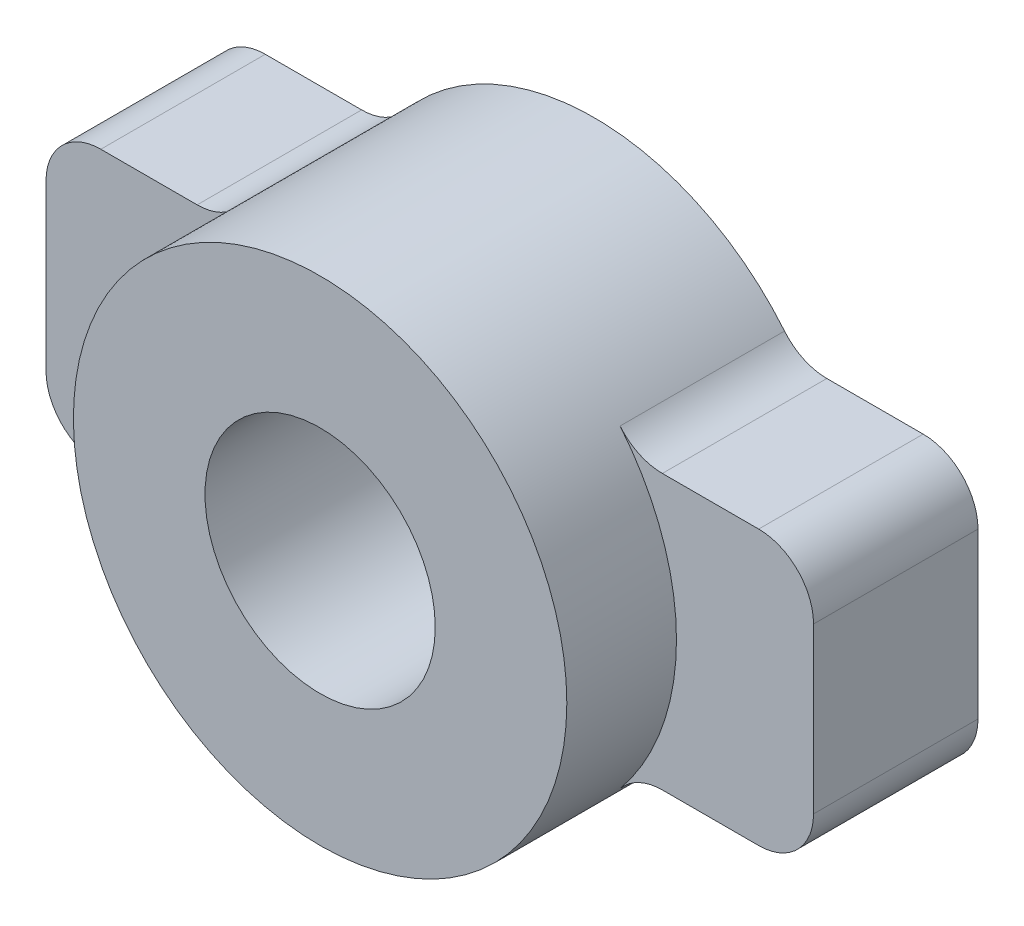
ISO-10303-21;
HEADER;
FILE_DESCRIPTION(('STEP AP214'),'2;1');
FILE_NAME('part.step','',(''),(''),'','','');
FILE_SCHEMA(('AUTOMOTIVE_DESIGN { 1 0 10303 214 1 1 1 1 }'));
ENDSEC;
DATA;
#1=APPLICATION_CONTEXT('core data for automotive mechanical design processes');
#2=APPLICATION_PROTOCOL_DEFINITION('international standard','automotive_design',2000,#1);
#3=PRODUCT_CONTEXT('',#1,'mechanical');
#4=PRODUCT('Part','Part','',(#3));
#5=PRODUCT_RELATED_PRODUCT_CATEGORY('part','',(#4));
#6=PRODUCT_DEFINITION_FORMATION('','',#4);
#7=PRODUCT_DEFINITION_CONTEXT('part definition',#1,'design');
#8=PRODUCT_DEFINITION('design','',#6,#7);
#9=PRODUCT_DEFINITION_SHAPE('','',#8);
#10=(LENGTH_UNIT() NAMED_UNIT(*) SI_UNIT(.MILLI.,.METRE.));
#11=(NAMED_UNIT(*) PLANE_ANGLE_UNIT() SI_UNIT($,.RADIAN.));
#12=(NAMED_UNIT(*) SI_UNIT($,.STERADIAN.) SOLID_ANGLE_UNIT());
#13=UNCERTAINTY_MEASURE_WITH_UNIT(LENGTH_MEASURE(1.E-05),#10,'distance_accuracy_value','');
#14=(GEOMETRIC_REPRESENTATION_CONTEXT(3) GLOBAL_UNCERTAINTY_ASSIGNED_CONTEXT((#13)) GLOBAL_UNIT_ASSIGNED_CONTEXT((#10,
#11,#12)) REPRESENTATION_CONTEXT('',''));
#15=CARTESIAN_POINT('',(0.,0.,0.));
#16=DIRECTION('',(0.,0.,1.));
#17=DIRECTION('',(1.,0.,0.));
#18=AXIS2_PLACEMENT_3D('',#15,#16,#17);
#19=CARTESIAN_POINT('',(0.,0.,5.));
#20=DIRECTION('',(0.,0.,-1.));
#21=DIRECTION('',(-1.,0.,0.));
#22=AXIS2_PLACEMENT_3D('',#19,#20,#21);
#23=CYLINDRICAL_SURFACE('',#22,4.5);
#24=CARTESIAN_POINT('',(0.,0.,0.));
#25=DIRECTION('',(0.,0.,1.));
#26=DIRECTION('',(1.,0.,0.));
#27=AXIS2_PLACEMENT_3D('',#24,#25,#26);
#28=CIRCLE('',#27,4.5);
#29=CARTESIAN_POINT('',(3.47125147127942,2.86363636363636,0.));
#30=VERTEX_POINT('',#29);
#31=CARTESIAN_POINT('',(-3.47125147127941,2.86363636363636,0.));
#32=VERTEX_POINT('',#31);
#33=EDGE_CURVE('E182',#30,#32,#28,.T.);
#34=ORIENTED_EDGE('',*,*,#33,.T.);
#35=DIRECTION('',(0.,0.,-1.));
#36=VECTOR('',#35,1.);
#37=CARTESIAN_POINT('',(-3.47125147127942,2.86363636363636,5.));
#38=LINE('',#37,#36);
#39=CARTESIAN_POINT('',(-3.47125147127941,2.86363636363636,3.));
#40=VERTEX_POINT('',#39);
#41=EDGE_CURVE('E175',#32,#40,#38,.F.);
#42=ORIENTED_EDGE('',*,*,#41,.T.);
#43=CARTESIAN_POINT('',(0.,0.,3.));
#44=DIRECTION('',(0.,0.,1.));
#45=DIRECTION('',(1.,0.,0.));
#46=AXIS2_PLACEMENT_3D('',#43,#44,#45);
#47=CIRCLE('',#46,4.5);
#48=CARTESIAN_POINT('',(-3.47125147127941,-2.86363636363636,3.));
#49=VERTEX_POINT('',#48);
#50=EDGE_CURVE('E173',#40,#49,#47,.T.);
#51=ORIENTED_EDGE('',*,*,#50,.T.);
#52=DIRECTION('',(0.,0.,-1.));
#53=VECTOR('',#52,1.);
#54=CARTESIAN_POINT('',(-3.47125147127942,-2.86363636363636,5.));
#55=LINE('',#54,#53);
#56=CARTESIAN_POINT('',(-3.47125147127941,-2.86363636363636,0.));
#57=VERTEX_POINT('',#56);
#58=EDGE_CURVE('E156',#49,#57,#55,.T.);
#59=ORIENTED_EDGE('',*,*,#58,.T.);
#60=CARTESIAN_POINT('',(3.47125147127942,-2.86363636363636,0.));
#61=VERTEX_POINT('',#60);
#62=EDGE_CURVE('E170',#57,#61,#28,.T.);
#63=ORIENTED_EDGE('',*,*,#62,.T.);
#64=DIRECTION('',(0.,0.,-1.));
#65=VECTOR('',#64,1.);
#66=CARTESIAN_POINT('',(3.47125147127942,-2.86363636363636,5.));
#67=LINE('',#66,#65);
#68=CARTESIAN_POINT('',(3.47125147127942,-2.86363636363636,3.));
#69=VERTEX_POINT('',#68);
#70=EDGE_CURVE('E193',#61,#69,#67,.F.);
#71=ORIENTED_EDGE('',*,*,#70,.T.);
#72=CARTESIAN_POINT('',(3.47125147127942,2.86363636363636,3.));
#73=VERTEX_POINT('',#72);
#74=EDGE_CURVE('E191',#69,#73,#47,.T.);
#75=ORIENTED_EDGE('',*,*,#74,.T.);
#76=DIRECTION('',(0.,0.,-1.));
#77=VECTOR('',#76,1.);
#78=CARTESIAN_POINT('',(3.47125147127942,2.86363636363636,5.));
#79=LINE('',#78,#77);
#80=EDGE_CURVE('E176',#73,#30,#79,.T.);
#81=ORIENTED_EDGE('',*,*,#80,.T.);
#82=EDGE_LOOP('',(#34,#42,#51,#59,#63,#71,#75,#81));
#83=FACE_BOUND('',#82,.T.);
#84=CARTESIAN_POINT('',(0.,0.,5.));
#85=DIRECTION('',(0.,0.,1.));
#86=DIRECTION('',(1.,0.,0.));
#87=AXIS2_PLACEMENT_3D('',#84,#85,#86);
#88=CIRCLE('',#87,4.5);
#89=CARTESIAN_POINT('',(4.5,0.,5.));
#90=VERTEX_POINT('',#89);
#91=EDGE_CURVE('E185',#90,#90,#88,.T.);
#92=ORIENTED_EDGE('',*,*,#91,.F.);
#93=EDGE_LOOP('',(#92));
#94=FACE_BOUND('',#93,.T.);
#95=ADVANCED_FACE('F40',(#83,#94),#23,.T.);
#96=CARTESIAN_POINT('',(0.,0.,5.));
#97=DIRECTION('',(0.,0.,1.));
#98=DIRECTION('',(1.,0.,0.));
#99=AXIS2_PLACEMENT_3D('',#96,#97,#98);
#100=PLANE('',#99);
#101=CARTESIAN_POINT('',(0.,0.,5.));
#102=DIRECTION('',(0.,0.,1.));
#103=DIRECTION('',(1.,0.,0.));
#104=AXIS2_PLACEMENT_3D('',#101,#102,#103);
#105=CIRCLE('',#104,2.1);
#106=CARTESIAN_POINT('',(2.1,0.,5.));
#107=VERTEX_POINT('',#106);
#108=EDGE_CURVE('E384',#107,#107,#105,.T.);
#109=ORIENTED_EDGE('',*,*,#108,.F.);
#110=EDGE_LOOP('',(#109));
#111=FACE_BOUND('',#110,.T.);
#112=ORIENTED_EDGE('',*,*,#91,.T.);
#113=EDGE_LOOP('',(#112));
#114=FACE_BOUND('',#113,.T.);
#115=ADVANCED_FACE('F326',(#111,#114),#100,.T.);
#116=CARTESIAN_POINT('',(0.,0.,0.));
#117=DIRECTION('',(0.,0.,1.));
#118=DIRECTION('',(1.,0.,0.));
#119=AXIS2_PLACEMENT_3D('',#116,#117,#118);
#120=PLANE('',#119);
#121=CARTESIAN_POINT('',(0.,0.,0.));
#122=DIRECTION('',(0.,0.,1.));
#123=DIRECTION('',(1.,0.,0.));
#124=AXIS2_PLACEMENT_3D('',#121,#122,#123);
#125=CIRCLE('',#124,2.1);
#126=CARTESIAN_POINT('',(2.1,0.,0.));
#127=VERTEX_POINT('',#126);
#128=EDGE_CURVE('E290',#127,#127,#125,.T.);
#129=ORIENTED_EDGE('',*,*,#128,.T.);
#130=EDGE_LOOP('',(#129));
#131=FACE_BOUND('',#130,.T.);
#132=DIRECTION('',(0.,1.,0.));
#133=VECTOR('',#132,1.);
#134=CARTESIAN_POINT('',(-7.,-2.5,0.));
#135=LINE('',#134,#133);
#136=CARTESIAN_POINT('',(-7.,-1.5,0.));
#137=VERTEX_POINT('',#136);
#138=CARTESIAN_POINT('',(-7.,1.5,0.));
#139=VERTEX_POINT('',#138);
#140=EDGE_CURVE('E287',#137,#139,#135,.T.);
#141=ORIENTED_EDGE('',*,*,#140,.T.);
#142=CARTESIAN_POINT('',(-6.,1.5,0.));
#143=DIRECTION('',(0.,0.,1.));
#144=DIRECTION('',(1.,0.,0.));
#145=AXIS2_PLACEMENT_3D('',#142,#143,#144);
#146=CIRCLE('',#145,1.);
#147=CARTESIAN_POINT('',(-6.,2.5,0.));
#148=VERTEX_POINT('',#147);
#149=EDGE_CURVE('E213',#139,#148,#146,.F.);
#150=ORIENTED_EDGE('',*,*,#149,.T.);
#151=DIRECTION('',(1.,0.,0.));
#152=VECTOR('',#151,1.);
#153=CARTESIAN_POINT('',(7.,2.5,0.));
#154=LINE('',#153,#152);
#155=CARTESIAN_POINT('',(-4.24264068711929,2.5,0.));
#156=VERTEX_POINT('',#155);
#157=EDGE_CURVE('E265',#148,#156,#154,.T.);
#158=ORIENTED_EDGE('',*,*,#157,.T.);
#159=CARTESIAN_POINT('',(-4.24264068711928,3.5,0.));
#160=DIRECTION('',(0.,0.,1.));
#161=DIRECTION('',(1.,0.,0.));
#162=AXIS2_PLACEMENT_3D('',#159,#160,#161);
#163=CIRCLE('',#162,1.);
#164=EDGE_CURVE('E163',#156,#32,#163,.T.);
#165=ORIENTED_EDGE('',*,*,#164,.T.);
#166=ORIENTED_EDGE('',*,*,#33,.F.);
#167=CARTESIAN_POINT('',(4.24264068711928,3.5,0.));
#168=DIRECTION('',(0.,0.,1.));
#169=DIRECTION('',(1.,0.,0.));
#170=AXIS2_PLACEMENT_3D('',#167,#168,#169);
#171=CIRCLE('',#170,1.);
#172=CARTESIAN_POINT('',(4.24264068711928,2.5,0.));
#173=VERTEX_POINT('',#172);
#174=EDGE_CURVE('E244',#30,#173,#171,.T.);
#175=ORIENTED_EDGE('',*,*,#174,.T.);
#176=CARTESIAN_POINT('',(6.,2.5,0.));
#177=VERTEX_POINT('',#176);
#178=EDGE_CURVE('E289',#173,#177,#154,.T.);
#179=ORIENTED_EDGE('',*,*,#178,.T.);
#180=CARTESIAN_POINT('',(6.,1.5,0.));
#181=DIRECTION('',(0.,0.,1.));
#182=DIRECTION('',(1.,0.,0.));
#183=AXIS2_PLACEMENT_3D('',#180,#181,#182);
#184=CIRCLE('',#183,1.);
#185=CARTESIAN_POINT('',(7.,1.5,0.));
#186=VERTEX_POINT('',#185);
#187=EDGE_CURVE('E209',#177,#186,#184,.F.);
#188=ORIENTED_EDGE('',*,*,#187,.T.);
#189=DIRECTION('',(0.,-1.,0.));
#190=VECTOR('',#189,1.);
#191=CARTESIAN_POINT('',(7.,-2.5,0.));
#192=LINE('',#191,#190);
#193=CARTESIAN_POINT('',(7.,-1.5,0.));
#194=VERTEX_POINT('',#193);
#195=EDGE_CURVE('E292',#186,#194,#192,.T.);
#196=ORIENTED_EDGE('',*,*,#195,.T.);
#197=CARTESIAN_POINT('',(6.,-1.5,0.));
#198=DIRECTION('',(0.,0.,1.));
#199=DIRECTION('',(1.,0.,0.));
#200=AXIS2_PLACEMENT_3D('',#197,#198,#199);
#201=CIRCLE('',#200,1.);
#202=CARTESIAN_POINT('',(6.,-2.5,0.));
#203=VERTEX_POINT('',#202);
#204=EDGE_CURVE('E207',#194,#203,#201,.F.);
#205=ORIENTED_EDGE('',*,*,#204,.T.);
#206=DIRECTION('',(-1.,0.,0.));
#207=VECTOR('',#206,1.);
#208=CARTESIAN_POINT('',(7.,-2.5,0.));
#209=LINE('',#208,#207);
#210=CARTESIAN_POINT('',(4.24264068711928,-2.5,0.));
#211=VERTEX_POINT('',#210);
#212=EDGE_CURVE('E295',#203,#211,#209,.T.);
#213=ORIENTED_EDGE('',*,*,#212,.T.);
#214=CARTESIAN_POINT('',(4.24264068711928,-3.5,0.));
#215=DIRECTION('',(0.,0.,1.));
#216=DIRECTION('',(1.,0.,0.));
#217=AXIS2_PLACEMENT_3D('',#214,#215,#216);
#218=CIRCLE('',#217,1.);
#219=EDGE_CURVE('E11',#211,#61,#218,.T.);
#220=ORIENTED_EDGE('',*,*,#219,.T.);
#221=ORIENTED_EDGE('',*,*,#62,.F.);
#222=CARTESIAN_POINT('',(-4.24264068711928,-3.5,0.));
#223=DIRECTION('',(0.,0.,1.));
#224=DIRECTION('',(1.,0.,0.));
#225=AXIS2_PLACEMENT_3D('',#222,#223,#224);
#226=CIRCLE('',#225,1.);
#227=CARTESIAN_POINT('',(-4.24264068711929,-2.5,0.));
#228=VERTEX_POINT('',#227);
#229=EDGE_CURVE('E152',#57,#228,#226,.T.);
#230=ORIENTED_EDGE('',*,*,#229,.T.);
#231=CARTESIAN_POINT('',(-6.,-2.5,0.));
#232=VERTEX_POINT('',#231);
#233=EDGE_CURVE('E294',#228,#232,#209,.T.);
#234=ORIENTED_EDGE('',*,*,#233,.T.);
#235=CARTESIAN_POINT('',(-6.,-1.5,0.));
#236=DIRECTION('',(0.,0.,1.));
#237=DIRECTION('',(1.,0.,0.));
#238=AXIS2_PLACEMENT_3D('',#235,#236,#237);
#239=CIRCLE('',#238,1.);
#240=EDGE_CURVE('E211',#232,#137,#239,.F.);
#241=ORIENTED_EDGE('',*,*,#240,.T.);
#242=EDGE_LOOP('',(#141,#150,#158,#165,#166,#175,#179,#188,#196,#205,#213,#220,#221,#230,#234,#241));
#243=FACE_BOUND('',#242,.T.);
#244=ADVANCED_FACE('F179',(#131,#243),#120,.F.);
#245=CARTESIAN_POINT('',(7.,-2.5,3.));
#246=DIRECTION('',(1.,0.,0.));
#247=DIRECTION('',(0.,0.,-1.));
#248=AXIS2_PLACEMENT_3D('',#245,#246,#247);
#249=PLANE('',#248);
#250=ORIENTED_EDGE('',*,*,#195,.F.);
#251=DIRECTION('',(0.,0.,-1.));
#252=VECTOR('',#251,1.);
#253=CARTESIAN_POINT('',(7.,1.5,3.));
#254=LINE('',#253,#252);
#255=CARTESIAN_POINT('',(7.,1.5,3.));
#256=VERTEX_POINT('',#255);
#257=EDGE_CURVE('E231',#186,#256,#254,.F.);
#258=ORIENTED_EDGE('',*,*,#257,.T.);
#259=DIRECTION('',(0.,-1.,0.));
#260=VECTOR('',#259,1.);
#261=CARTESIAN_POINT('',(7.,-2.5,3.));
#262=LINE('',#261,#260);
#263=CARTESIAN_POINT('',(7.,-1.5,3.));
#264=VERTEX_POINT('',#263);
#265=EDGE_CURVE('E279',#256,#264,#262,.T.);
#266=ORIENTED_EDGE('',*,*,#265,.T.);
#267=DIRECTION('',(0.,0.,-1.));
#268=VECTOR('',#267,1.);
#269=CARTESIAN_POINT('',(7.,-1.5,3.));
#270=LINE('',#269,#268);
#271=EDGE_CURVE('E228',#264,#194,#270,.T.);
#272=ORIENTED_EDGE('',*,*,#271,.T.);
#273=EDGE_LOOP('',(#250,#258,#266,#272));
#274=FACE_BOUND('',#273,.T.);
#275=ADVANCED_FACE('F361',(#274),#249,.T.);
#276=CARTESIAN_POINT('',(0.,0.,3.));
#277=DIRECTION('',(0.,0.,1.));
#278=DIRECTION('',(1.,0.,0.));
#279=AXIS2_PLACEMENT_3D('',#276,#277,#278);
#280=PLANE('',#279);
#281=ORIENTED_EDGE('',*,*,#265,.F.);
#282=CARTESIAN_POINT('',(6.,1.5,3.));
#283=DIRECTION('',(0.,0.,1.));
#284=DIRECTION('',(1.,0.,0.));
#285=AXIS2_PLACEMENT_3D('',#282,#283,#284);
#286=CIRCLE('',#285,1.);
#287=CARTESIAN_POINT('',(6.,2.5,3.));
#288=VERTEX_POINT('',#287);
#289=EDGE_CURVE('E235',#256,#288,#286,.T.);
#290=ORIENTED_EDGE('',*,*,#289,.T.);
#291=DIRECTION('',(1.,0.,0.));
#292=VECTOR('',#291,1.);
#293=CARTESIAN_POINT('',(7.,2.5,3.));
#294=LINE('',#293,#292);
#295=CARTESIAN_POINT('',(4.24264068711928,2.5,3.));
#296=VERTEX_POINT('',#295);
#297=EDGE_CURVE('E254',#296,#288,#294,.T.);
#298=ORIENTED_EDGE('',*,*,#297,.F.);
#299=CARTESIAN_POINT('',(4.24264068711928,3.5,3.));
#300=DIRECTION('',(0.,0.,1.));
#301=DIRECTION('',(1.,0.,0.));
#302=AXIS2_PLACEMENT_3D('',#299,#300,#301);
#303=CIRCLE('',#302,1.);
#304=EDGE_CURVE('E246',#296,#73,#303,.F.);
#305=ORIENTED_EDGE('',*,*,#304,.T.);
#306=ORIENTED_EDGE('',*,*,#74,.F.);
#307=CARTESIAN_POINT('',(4.24264068711928,-3.5,3.));
#308=DIRECTION('',(0.,0.,1.));
#309=DIRECTION('',(1.,0.,0.));
#310=AXIS2_PLACEMENT_3D('',#307,#308,#309);
#311=CIRCLE('',#310,1.);
#312=CARTESIAN_POINT('',(4.24264068711928,-2.5,3.));
#313=VERTEX_POINT('',#312);
#314=EDGE_CURVE('E48',#69,#313,#311,.F.);
#315=ORIENTED_EDGE('',*,*,#314,.T.);
#316=DIRECTION('',(-1.,0.,0.));
#317=VECTOR('',#316,1.);
#318=CARTESIAN_POINT('',(7.,-2.5,3.));
#319=LINE('',#318,#317);
#320=CARTESIAN_POINT('',(6.,-2.5,3.));
#321=VERTEX_POINT('',#320);
#322=EDGE_CURVE('E183',#321,#313,#319,.T.);
#323=ORIENTED_EDGE('',*,*,#322,.F.);
#324=CARTESIAN_POINT('',(6.,-1.5,3.));
#325=DIRECTION('',(0.,0.,1.));
#326=DIRECTION('',(1.,0.,0.));
#327=AXIS2_PLACEMENT_3D('',#324,#325,#326);
#328=CIRCLE('',#327,1.);
#329=EDGE_CURVE('E233',#321,#264,#328,.T.);
#330=ORIENTED_EDGE('',*,*,#329,.T.);
#331=EDGE_LOOP('',(#281,#290,#298,#305,#306,#315,#323,#330));
#332=FACE_BOUND('',#331,.T.);
#333=ADVANCED_FACE('F252',(#332),#280,.T.);
#334=CARTESIAN_POINT('',(7.,2.5,3.));
#335=DIRECTION('',(0.,1.,0.));
#336=DIRECTION('',(-1.,0.,0.));
#337=AXIS2_PLACEMENT_3D('',#334,#335,#336);
#338=PLANE('',#337);
#339=ORIENTED_EDGE('',*,*,#297,.T.);
#340=DIRECTION('',(0.,0.,-1.));
#341=VECTOR('',#340,1.);
#342=CARTESIAN_POINT('',(6.,2.5,3.));
#343=LINE('',#342,#341);
#344=EDGE_CURVE('E225',#288,#177,#343,.T.);
#345=ORIENTED_EDGE('',*,*,#344,.T.);
#346=ORIENTED_EDGE('',*,*,#178,.F.);
#347=DIRECTION('',(0.,0.,-1.));
#348=VECTOR('',#347,1.);
#349=CARTESIAN_POINT('',(4.24264068711928,2.5,3.));
#350=LINE('',#349,#348);
#351=EDGE_CURVE('E223',#173,#296,#350,.F.);
#352=ORIENTED_EDGE('',*,*,#351,.T.);
#353=EDGE_LOOP('',(#339,#345,#346,#352));
#354=FACE_BOUND('',#353,.T.);
#355=ADVANCED_FACE('F321',(#354),#338,.T.);
#356=CARTESIAN_POINT('',(7.,-2.5,3.));
#357=DIRECTION('',(0.,-1.,0.));
#358=DIRECTION('',(1.,0.,0.));
#359=AXIS2_PLACEMENT_3D('',#356,#357,#358);
#360=PLANE('',#359);
#361=ORIENTED_EDGE('',*,*,#322,.T.);
#362=DIRECTION('',(0.,0.,-1.));
#363=VECTOR('',#362,1.);
#364=CARTESIAN_POINT('',(4.24264068711928,-2.5,3.));
#365=LINE('',#364,#363);
#366=EDGE_CURVE('E238',#313,#211,#365,.T.);
#367=ORIENTED_EDGE('',*,*,#366,.T.);
#368=ORIENTED_EDGE('',*,*,#212,.F.);
#369=DIRECTION('',(0.,0.,-1.));
#370=VECTOR('',#369,1.);
#371=CARTESIAN_POINT('',(6.,-2.5,3.));
#372=LINE('',#371,#370);
#373=EDGE_CURVE('E61',#203,#321,#372,.F.);
#374=ORIENTED_EDGE('',*,*,#373,.T.);
#375=EDGE_LOOP('',(#361,#367,#368,#374));
#376=FACE_BOUND('',#375,.T.);
#377=ADVANCED_FACE('F315',(#376),#360,.T.);
#378=CARTESIAN_POINT('',(-6.,2.5,3.));
#379=VERTEX_POINT('',#378);
#380=CARTESIAN_POINT('',(-4.24264068711929,2.5,3.));
#381=VERTEX_POINT('',#380);
#382=EDGE_CURVE('E274',#379,#381,#294,.T.);
#383=ORIENTED_EDGE('',*,*,#382,.F.);
#384=CARTESIAN_POINT('',(-6.,1.5,3.));
#385=DIRECTION('',(0.,0.,1.));
#386=DIRECTION('',(1.,0.,0.));
#387=AXIS2_PLACEMENT_3D('',#384,#385,#386);
#388=CIRCLE('',#387,1.);
#389=CARTESIAN_POINT('',(-7.,1.5,3.));
#390=VERTEX_POINT('',#389);
#391=EDGE_CURVE('E217',#379,#390,#388,.T.);
#392=ORIENTED_EDGE('',*,*,#391,.T.);
#393=DIRECTION('',(0.,1.,0.));
#394=VECTOR('',#393,1.);
#395=CARTESIAN_POINT('',(-7.,-2.5,3.));
#396=LINE('',#395,#394);
#397=CARTESIAN_POINT('',(-7.,-1.5,3.));
#398=VERTEX_POINT('',#397);
#399=EDGE_CURVE('E283',#398,#390,#396,.T.);
#400=ORIENTED_EDGE('',*,*,#399,.F.);
#401=CARTESIAN_POINT('',(-6.,-1.5,3.));
#402=DIRECTION('',(0.,0.,1.));
#403=DIRECTION('',(1.,0.,0.));
#404=AXIS2_PLACEMENT_3D('',#401,#402,#403);
#405=CIRCLE('',#404,1.);
#406=CARTESIAN_POINT('',(-6.,-2.5,3.));
#407=VERTEX_POINT('',#406);
#408=EDGE_CURVE('E215',#398,#407,#405,.T.);
#409=ORIENTED_EDGE('',*,*,#408,.T.);
#410=CARTESIAN_POINT('',(-4.24264068711929,-2.5,3.));
#411=VERTEX_POINT('',#410);
#412=EDGE_CURVE('E186',#411,#407,#319,.T.);
#413=ORIENTED_EDGE('',*,*,#412,.F.);
#414=CARTESIAN_POINT('',(-4.24264068711928,-3.5,3.));
#415=DIRECTION('',(0.,0.,1.));
#416=DIRECTION('',(1.,0.,0.));
#417=AXIS2_PLACEMENT_3D('',#414,#415,#416);
#418=CIRCLE('',#417,1.);
#419=EDGE_CURVE('E162',#411,#49,#418,.F.);
#420=ORIENTED_EDGE('',*,*,#419,.T.);
#421=ORIENTED_EDGE('',*,*,#50,.F.);
#422=CARTESIAN_POINT('',(-4.24264068711928,3.5,3.));
#423=DIRECTION('',(0.,0.,1.));
#424=DIRECTION('',(1.,0.,0.));
#425=AXIS2_PLACEMENT_3D('',#422,#423,#424);
#426=CIRCLE('',#425,1.);
#427=EDGE_CURVE('E240',#40,#381,#426,.F.);
#428=ORIENTED_EDGE('',*,*,#427,.T.);
#429=EDGE_LOOP('',(#383,#392,#400,#409,#413,#420,#421,#428));
#430=FACE_BOUND('',#429,.T.);
#431=ADVANCED_FACE('F273',(#430),#280,.T.);
#432=ORIENTED_EDGE('',*,*,#412,.T.);
#433=DIRECTION('',(0.,0.,-1.));
#434=VECTOR('',#433,1.);
#435=CARTESIAN_POINT('',(-6.,-2.5,3.));
#436=LINE('',#435,#434);
#437=EDGE_CURVE('E220',#407,#232,#436,.T.);
#438=ORIENTED_EDGE('',*,*,#437,.T.);
#439=ORIENTED_EDGE('',*,*,#233,.F.);
#440=DIRECTION('',(0.,0.,-1.));
#441=VECTOR('',#440,1.);
#442=CARTESIAN_POINT('',(-4.24264068711929,-2.5,3.));
#443=LINE('',#442,#441);
#444=EDGE_CURVE('E157',#228,#411,#443,.F.);
#445=ORIENTED_EDGE('',*,*,#444,.T.);
#446=EDGE_LOOP('',(#432,#438,#439,#445));
#447=FACE_BOUND('',#446,.T.);
#448=ADVANCED_FACE('F312',(#447),#360,.T.);
#449=ORIENTED_EDGE('',*,*,#382,.T.);
#450=DIRECTION('',(0.,0.,-1.));
#451=VECTOR('',#450,1.);
#452=CARTESIAN_POINT('',(-4.24264068711929,2.5,3.));
#453=LINE('',#452,#451);
#454=EDGE_CURVE('E200',#381,#156,#453,.T.);
#455=ORIENTED_EDGE('',*,*,#454,.T.);
#456=ORIENTED_EDGE('',*,*,#157,.F.);
#457=DIRECTION('',(0.,0.,-1.));
#458=VECTOR('',#457,1.);
#459=CARTESIAN_POINT('',(-6.,2.5,3.));
#460=LINE('',#459,#458);
#461=EDGE_CURVE('E198',#148,#379,#460,.F.);
#462=ORIENTED_EDGE('',*,*,#461,.T.);
#463=EDGE_LOOP('',(#449,#455,#456,#462));
#464=FACE_BOUND('',#463,.T.);
#465=ADVANCED_FACE('F277',(#464),#338,.T.);
#466=CARTESIAN_POINT('',(-7.,-2.5,3.));
#467=DIRECTION('',(-1.,0.,0.));
#468=DIRECTION('',(0.,0.,1.));
#469=AXIS2_PLACEMENT_3D('',#466,#467,#468);
#470=PLANE('',#469);
#471=ORIENTED_EDGE('',*,*,#399,.T.);
#472=DIRECTION('',(0.,0.,-1.));
#473=VECTOR('',#472,1.);
#474=CARTESIAN_POINT('',(-7.,1.5,3.));
#475=LINE('',#474,#473);
#476=EDGE_CURVE('E204',#390,#139,#475,.T.);
#477=ORIENTED_EDGE('',*,*,#476,.T.);
#478=ORIENTED_EDGE('',*,*,#140,.F.);
#479=DIRECTION('',(0.,0.,-1.));
#480=VECTOR('',#479,1.);
#481=CARTESIAN_POINT('',(-7.,-1.5,3.));
#482=LINE('',#481,#480);
#483=EDGE_CURVE('E202',#137,#398,#482,.F.);
#484=ORIENTED_EDGE('',*,*,#483,.T.);
#485=EDGE_LOOP('',(#471,#477,#478,#484));
#486=FACE_BOUND('',#485,.T.);
#487=ADVANCED_FACE('F300',(#486),#470,.T.);
#488=CARTESIAN_POINT('',(0.,0.,5.));
#489=DIRECTION('',(0.,0.,1.));
#490=DIRECTION('',(1.,0.,0.));
#491=AXIS2_PLACEMENT_3D('',#488,#489,#490);
#492=CYLINDRICAL_SURFACE('',#491,2.1);
#493=ORIENTED_EDGE('',*,*,#128,.F.);
#494=EDGE_LOOP('',(#493));
#495=FACE_BOUND('',#494,.T.);
#496=ORIENTED_EDGE('',*,*,#108,.T.);
#497=EDGE_LOOP('',(#496));
#498=FACE_BOUND('',#497,.T.);
#499=ADVANCED_FACE('F337',(#495,#498),#492,.F.);
#500=CARTESIAN_POINT('',(-4.24264068711928,3.5,5.));
#501=DIRECTION('',(0.,0.,-1.));
#502=DIRECTION('',(-1.,0.,0.));
#503=AXIS2_PLACEMENT_3D('',#500,#501,#502);
#504=CYLINDRICAL_SURFACE('',#503,1.);
#505=ORIENTED_EDGE('',*,*,#164,.F.);
#506=ORIENTED_EDGE('',*,*,#454,.F.);
#507=ORIENTED_EDGE('',*,*,#427,.F.);
#508=ORIENTED_EDGE('',*,*,#41,.F.);
#509=EDGE_LOOP('',(#505,#506,#507,#508));
#510=FACE_BOUND('',#509,.T.);
#511=ADVANCED_FACE('F268',(#510),#504,.F.);
#512=CARTESIAN_POINT('',(-6.,1.5,3.));
#513=DIRECTION('',(0.,0.,-1.));
#514=DIRECTION('',(-1.,0.,0.));
#515=AXIS2_PLACEMENT_3D('',#512,#513,#514);
#516=CYLINDRICAL_SURFACE('',#515,1.);
#517=ORIENTED_EDGE('',*,*,#391,.F.);
#518=ORIENTED_EDGE('',*,*,#461,.F.);
#519=ORIENTED_EDGE('',*,*,#149,.F.);
#520=ORIENTED_EDGE('',*,*,#476,.F.);
#521=EDGE_LOOP('',(#517,#518,#519,#520));
#522=FACE_BOUND('',#521,.T.);
#523=ADVANCED_FACE('F305',(#522),#516,.T.);
#524=CARTESIAN_POINT('',(-6.,-1.5,3.));
#525=DIRECTION('',(0.,0.,-1.));
#526=DIRECTION('',(-1.,0.,0.));
#527=AXIS2_PLACEMENT_3D('',#524,#525,#526);
#528=CYLINDRICAL_SURFACE('',#527,1.);
#529=ORIENTED_EDGE('',*,*,#408,.F.);
#530=ORIENTED_EDGE('',*,*,#483,.F.);
#531=ORIENTED_EDGE('',*,*,#240,.F.);
#532=ORIENTED_EDGE('',*,*,#437,.F.);
#533=EDGE_LOOP('',(#529,#530,#531,#532));
#534=FACE_BOUND('',#533,.T.);
#535=ADVANCED_FACE('F307',(#534),#528,.T.);
#536=CARTESIAN_POINT('',(-4.24264068711928,-3.5,5.));
#537=DIRECTION('',(0.,0.,-1.));
#538=DIRECTION('',(-1.,0.,0.));
#539=AXIS2_PLACEMENT_3D('',#536,#537,#538);
#540=CYLINDRICAL_SURFACE('',#539,1.);
#541=ORIENTED_EDGE('',*,*,#419,.F.);
#542=ORIENTED_EDGE('',*,*,#444,.F.);
#543=ORIENTED_EDGE('',*,*,#229,.F.);
#544=ORIENTED_EDGE('',*,*,#58,.F.);
#545=EDGE_LOOP('',(#541,#542,#543,#544));
#546=FACE_BOUND('',#545,.T.);
#547=ADVANCED_FACE('F155',(#546),#540,.F.);
#548=CARTESIAN_POINT('',(6.,1.5,3.));
#549=DIRECTION('',(0.,0.,-1.));
#550=DIRECTION('',(-1.,0.,0.));
#551=AXIS2_PLACEMENT_3D('',#548,#549,#550);
#552=CYLINDRICAL_SURFACE('',#551,1.);
#553=ORIENTED_EDGE('',*,*,#289,.F.);
#554=ORIENTED_EDGE('',*,*,#257,.F.);
#555=ORIENTED_EDGE('',*,*,#187,.F.);
#556=ORIENTED_EDGE('',*,*,#344,.F.);
#557=EDGE_LOOP('',(#553,#554,#555,#556));
#558=FACE_BOUND('',#557,.T.);
#559=ADVANCED_FACE('F344',(#558),#552,.T.);
#560=CARTESIAN_POINT('',(4.24264068711928,3.5,5.));
#561=DIRECTION('',(0.,0.,-1.));
#562=DIRECTION('',(-1.,0.,0.));
#563=AXIS2_PLACEMENT_3D('',#560,#561,#562);
#564=CYLINDRICAL_SURFACE('',#563,1.);
#565=ORIENTED_EDGE('',*,*,#304,.F.);
#566=ORIENTED_EDGE('',*,*,#351,.F.);
#567=ORIENTED_EDGE('',*,*,#174,.F.);
#568=ORIENTED_EDGE('',*,*,#80,.F.);
#569=EDGE_LOOP('',(#565,#566,#567,#568));
#570=FACE_BOUND('',#569,.T.);
#571=ADVANCED_FACE('F257',(#570),#564,.F.);
#572=CARTESIAN_POINT('',(4.24264068711928,-3.5,5.));
#573=DIRECTION('',(0.,0.,-1.));
#574=DIRECTION('',(-1.,0.,0.));
#575=AXIS2_PLACEMENT_3D('',#572,#573,#574);
#576=CYLINDRICAL_SURFACE('',#575,1.);
#577=ORIENTED_EDGE('',*,*,#219,.F.);
#578=ORIENTED_EDGE('',*,*,#366,.F.);
#579=ORIENTED_EDGE('',*,*,#314,.F.);
#580=ORIENTED_EDGE('',*,*,#70,.F.);
#581=EDGE_LOOP('',(#577,#578,#579,#580));
#582=FACE_BOUND('',#581,.T.);
#583=ADVANCED_FACE('F349',(#582),#576,.F.);
#584=CARTESIAN_POINT('',(6.,-1.5,3.));
#585=DIRECTION('',(0.,0.,-1.));
#586=DIRECTION('',(-1.,0.,0.));
#587=AXIS2_PLACEMENT_3D('',#584,#585,#586);
#588=CYLINDRICAL_SURFACE('',#587,1.);
#589=ORIENTED_EDGE('',*,*,#329,.F.);
#590=ORIENTED_EDGE('',*,*,#373,.F.);
#591=ORIENTED_EDGE('',*,*,#204,.F.);
#592=ORIENTED_EDGE('',*,*,#271,.F.);
#593=EDGE_LOOP('',(#589,#590,#591,#592));
#594=FACE_BOUND('',#593,.T.);
#595=ADVANCED_FACE('F42',(#594),#588,.T.);
#596=CLOSED_SHELL('',(#95,#115,#244,#275,#333,#355,#377,#431,#448,#465,#487,#499,#511,#523,#535,
#547,#559,#571,#583,#595));
#597=MANIFOLD_SOLID_BREP('B2',#596);
#598=ADVANCED_BREP_SHAPE_REPRESENTATION('',(#18,#597),#14);
#599=SHAPE_DEFINITION_REPRESENTATION(#9,#598);
ENDSEC;
END-ISO-10303-21;
